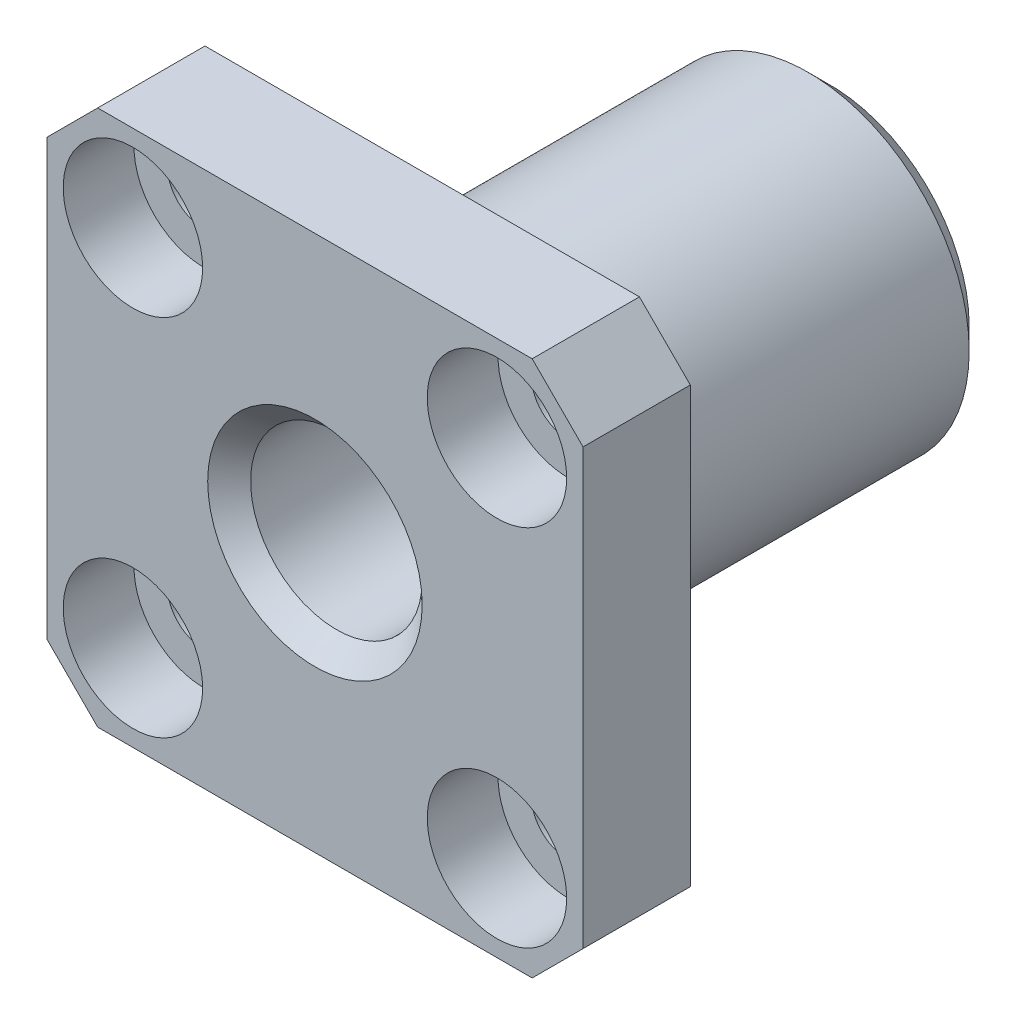
ISO-10303-21;
HEADER;
FILE_DESCRIPTION(('STEP AP214'),'2;1');
FILE_NAME('part.step','',(''),(''),'','','');
FILE_SCHEMA(('AUTOMOTIVE_DESIGN { 1 0 10303 214 1 1 1 1 }'));
ENDSEC;
DATA;
#1=APPLICATION_CONTEXT('core data for automotive mechanical design processes');
#2=APPLICATION_PROTOCOL_DEFINITION('international standard','automotive_design',2000,#1);
#3=PRODUCT_CONTEXT('',#1,'mechanical');
#4=PRODUCT('Part','Part','',(#3));
#5=PRODUCT_RELATED_PRODUCT_CATEGORY('part','',(#4));
#6=PRODUCT_DEFINITION_FORMATION('','',#4);
#7=PRODUCT_DEFINITION_CONTEXT('part definition',#1,'design');
#8=PRODUCT_DEFINITION('design','',#6,#7);
#9=PRODUCT_DEFINITION_SHAPE('','',#8);
#10=(LENGTH_UNIT() NAMED_UNIT(*) SI_UNIT(.MILLI.,.METRE.));
#11=(NAMED_UNIT(*) PLANE_ANGLE_UNIT() SI_UNIT($,.RADIAN.));
#12=(NAMED_UNIT(*) SI_UNIT($,.STERADIAN.) SOLID_ANGLE_UNIT());
#13=UNCERTAINTY_MEASURE_WITH_UNIT(LENGTH_MEASURE(1.E-05),#10,'distance_accuracy_value','');
#14=(GEOMETRIC_REPRESENTATION_CONTEXT(3) GLOBAL_UNCERTAINTY_ASSIGNED_CONTEXT((#13)) GLOBAL_UNIT_ASSIGNED_CONTEXT((#10,
#11,#12)) REPRESENTATION_CONTEXT('',''));
#15=CARTESIAN_POINT('',(0.,0.,0.));
#16=DIRECTION('',(0.,0.,1.));
#17=DIRECTION('',(1.,0.,0.));
#18=AXIS2_PLACEMENT_3D('',#15,#16,#17);
#19=CARTESIAN_POINT('',(0.,0.,24.));
#20=DIRECTION('',(0.,0.,-1.));
#21=DIRECTION('',(-1.,0.,0.));
#22=AXIS2_PLACEMENT_3D('',#19,#20,#21);
#23=CYLINDRICAL_SURFACE('',#22,7.5);
#24=CARTESIAN_POINT('',(0.,0.,1.));
#25=DIRECTION('',(0.,0.,1.));
#26=DIRECTION('',(1.,0.,0.));
#27=AXIS2_PLACEMENT_3D('',#24,#25,#26);
#28=CIRCLE('',#27,7.5);
#29=CARTESIAN_POINT('',(7.5,0.,1.));
#30=VERTEX_POINT('',#29);
#31=EDGE_CURVE('E140',#30,#30,#28,.T.);
#32=ORIENTED_EDGE('',*,*,#31,.T.);
#33=EDGE_LOOP('',(#32));
#34=FACE_BOUND('',#33,.T.);
#35=CARTESIAN_POINT('',(0.,0.,19.));
#36=DIRECTION('',(0.,0.,-1.));
#37=DIRECTION('',(-1.,0.,0.));
#38=AXIS2_PLACEMENT_3D('',#35,#36,#37);
#39=CIRCLE('',#38,7.5);
#40=CARTESIAN_POINT('',(-7.5,0.,19.));
#41=VERTEX_POINT('',#40);
#42=EDGE_CURVE('E137',#41,#41,#39,.T.);
#43=ORIENTED_EDGE('',*,*,#42,.T.);
#44=EDGE_LOOP('',(#43));
#45=FACE_BOUND('',#44,.T.);
#46=ADVANCED_FACE('F32',(#34,#45),#23,.T.);
#47=CARTESIAN_POINT('',(0.,0.,0.));
#48=DIRECTION('',(0.,0.,1.));
#49=DIRECTION('',(1.,0.,0.));
#50=AXIS2_PLACEMENT_3D('',#47,#48,#49);
#51=PLANE('',#50);
#52=CARTESIAN_POINT('',(0.,0.,0.));
#53=DIRECTION('',(0.,0.,1.));
#54=DIRECTION('',(1.,0.,0.));
#55=AXIS2_PLACEMENT_3D('',#52,#53,#54);
#56=CIRCLE('',#55,6.49999999999999);
#57=CARTESIAN_POINT('',(6.49999999999999,0.,0.));
#58=VERTEX_POINT('',#57);
#59=EDGE_CURVE('E163',#58,#58,#56,.F.);
#60=ORIENTED_EDGE('',*,*,#59,.T.);
#61=EDGE_LOOP('',(#60));
#62=FACE_BOUND('',#61,.T.);
#63=CARTESIAN_POINT('',(0.,0.,0.));
#64=DIRECTION('',(0.,0.,1.));
#65=DIRECTION('',(1.,0.,0.));
#66=AXIS2_PLACEMENT_3D('',#63,#64,#65);
#67=CIRCLE('',#66,4.);
#68=CARTESIAN_POINT('',(4.,0.,0.));
#69=VERTEX_POINT('',#68);
#70=EDGE_CURVE('E441',#69,#69,#67,.T.);
#71=ORIENTED_EDGE('',*,*,#70,.T.);
#72=EDGE_LOOP('',(#71));
#73=FACE_BOUND('',#72,.T.);
#74=ADVANCED_FACE('F180',(#62,#73),#51,.F.);
#75=CARTESIAN_POINT('',(12.5,-12.5,19.));
#76=DIRECTION('',(1.,0.,0.));
#77=DIRECTION('',(0.,0.,-1.));
#78=AXIS2_PLACEMENT_3D('',#75,#76,#77);
#79=PLANE('',#78);
#80=DIRECTION('',(0.,0.,1.));
#81=VECTOR('',#80,1.);
#82=CARTESIAN_POINT('',(12.5,-10.1274169979695,0.));
#83=LINE('',#82,#81);
#84=CARTESIAN_POINT('',(12.5,-10.1274169979695,19.));
#85=VERTEX_POINT('',#84);
#86=CARTESIAN_POINT('',(12.5,-10.1274169979695,24.));
#87=VERTEX_POINT('',#86);
#88=EDGE_CURVE('E473',#85,#87,#83,.T.);
#89=ORIENTED_EDGE('',*,*,#88,.F.);
#90=DIRECTION('',(0.,1.,0.));
#91=VECTOR('',#90,1.);
#92=CARTESIAN_POINT('',(12.5,-12.5,19.));
#93=LINE('',#92,#91);
#94=CARTESIAN_POINT('',(12.5,10.1274169979695,19.));
#95=VERTEX_POINT('',#94);
#96=EDGE_CURVE('E116',#85,#95,#93,.T.);
#97=ORIENTED_EDGE('',*,*,#96,.T.);
#98=DIRECTION('',(0.,0.,1.));
#99=VECTOR('',#98,1.);
#100=CARTESIAN_POINT('',(12.5,10.1274169979695,0.));
#101=LINE('',#100,#99);
#102=CARTESIAN_POINT('',(12.5,10.1274169979695,24.));
#103=VERTEX_POINT('',#102);
#104=EDGE_CURVE('E99',#95,#103,#101,.T.);
#105=ORIENTED_EDGE('',*,*,#104,.T.);
#106=DIRECTION('',(0.,1.,0.));
#107=VECTOR('',#106,1.);
#108=CARTESIAN_POINT('',(12.5,-12.5,24.));
#109=LINE('',#108,#107);
#110=EDGE_CURVE('E114',#87,#103,#109,.T.);
#111=ORIENTED_EDGE('',*,*,#110,.F.);
#112=EDGE_LOOP('',(#89,#97,#105,#111));
#113=FACE_BOUND('',#112,.T.);
#114=ADVANCED_FACE('F113',(#113),#79,.T.);
#115=CARTESIAN_POINT('',(-12.5,-12.5,19.));
#116=DIRECTION('',(0.,-1.,0.));
#117=DIRECTION('',(0.,0.,-1.));
#118=AXIS2_PLACEMENT_3D('',#115,#116,#117);
#119=PLANE('',#118);
#120=DIRECTION('',(0.,0.,1.));
#121=VECTOR('',#120,1.);
#122=CARTESIAN_POINT('',(-10.1274169979695,-12.5,0.));
#123=LINE('',#122,#121);
#124=CARTESIAN_POINT('',(-10.1274169979695,-12.5,19.));
#125=VERTEX_POINT('',#124);
#126=CARTESIAN_POINT('',(-10.1274169979695,-12.5,24.));
#127=VERTEX_POINT('',#126);
#128=EDGE_CURVE('E47',#125,#127,#123,.T.);
#129=ORIENTED_EDGE('',*,*,#128,.F.);
#130=DIRECTION('',(1.,0.,0.));
#131=VECTOR('',#130,1.);
#132=CARTESIAN_POINT('',(-12.5,-12.5,19.));
#133=LINE('',#132,#131);
#134=CARTESIAN_POINT('',(10.1274169979695,-12.5,19.));
#135=VERTEX_POINT('',#134);
#136=EDGE_CURVE('E130',#125,#135,#133,.T.);
#137=ORIENTED_EDGE('',*,*,#136,.T.);
#138=DIRECTION('',(0.,0.,1.));
#139=VECTOR('',#138,1.);
#140=CARTESIAN_POINT('',(10.1274169979695,-12.5,0.));
#141=LINE('',#140,#139);
#142=CARTESIAN_POINT('',(10.1274169979695,-12.5,24.));
#143=VERTEX_POINT('',#142);
#144=EDGE_CURVE('E107',#135,#143,#141,.T.);
#145=ORIENTED_EDGE('',*,*,#144,.T.);
#146=DIRECTION('',(1.,0.,0.));
#147=VECTOR('',#146,1.);
#148=CARTESIAN_POINT('',(-12.5,-12.5,24.));
#149=LINE('',#148,#147);
#150=EDGE_CURVE('E135',#127,#143,#149,.T.);
#151=ORIENTED_EDGE('',*,*,#150,.F.);
#152=EDGE_LOOP('',(#129,#137,#145,#151));
#153=FACE_BOUND('',#152,.T.);
#154=ADVANCED_FACE('F197',(#153),#119,.T.);
#155=CARTESIAN_POINT('',(-12.5,-12.5,19.));
#156=DIRECTION('',(-1.,0.,0.));
#157=DIRECTION('',(0.,0.,1.));
#158=AXIS2_PLACEMENT_3D('',#155,#156,#157);
#159=PLANE('',#158);
#160=DIRECTION('',(0.,0.,1.));
#161=VECTOR('',#160,1.);
#162=CARTESIAN_POINT('',(-12.5,-10.1274169979695,0.));
#163=LINE('',#162,#161);
#164=CARTESIAN_POINT('',(-12.5,-10.1274169979695,19.));
#165=VERTEX_POINT('',#164);
#166=CARTESIAN_POINT('',(-12.5,-10.1274169979695,24.));
#167=VERTEX_POINT('',#166);
#168=EDGE_CURVE('E478',#165,#167,#163,.T.);
#169=ORIENTED_EDGE('',*,*,#168,.T.);
#170=DIRECTION('',(0.,-1.,0.));
#171=VECTOR('',#170,1.);
#172=CARTESIAN_POINT('',(-12.5,-12.5,24.));
#173=LINE('',#172,#171);
#174=CARTESIAN_POINT('',(-12.5,10.1274169979695,24.));
#175=VERTEX_POINT('',#174);
#176=EDGE_CURVE('E125',#175,#167,#173,.T.);
#177=ORIENTED_EDGE('',*,*,#176,.F.);
#178=DIRECTION('',(0.,0.,1.));
#179=VECTOR('',#178,1.);
#180=CARTESIAN_POINT('',(-12.5,10.1274169979695,0.));
#181=LINE('',#180,#179);
#182=CARTESIAN_POINT('',(-12.5,10.1274169979695,19.));
#183=VERTEX_POINT('',#182);
#184=EDGE_CURVE('E55',#183,#175,#181,.T.);
#185=ORIENTED_EDGE('',*,*,#184,.F.);
#186=DIRECTION('',(0.,-1.,0.));
#187=VECTOR('',#186,1.);
#188=CARTESIAN_POINT('',(-12.5,-12.5,19.));
#189=LINE('',#188,#187);
#190=EDGE_CURVE('E495',#183,#165,#189,.T.);
#191=ORIENTED_EDGE('',*,*,#190,.T.);
#192=EDGE_LOOP('',(#169,#177,#185,#191));
#193=FACE_BOUND('',#192,.T.);
#194=ADVANCED_FACE('F201',(#193),#159,.T.);
#195=CARTESIAN_POINT('',(-12.5,12.5,19.));
#196=DIRECTION('',(0.,1.,0.));
#197=DIRECTION('',(0.,0.,1.));
#198=AXIS2_PLACEMENT_3D('',#195,#196,#197);
#199=PLANE('',#198);
#200=DIRECTION('',(0.,0.,1.));
#201=VECTOR('',#200,1.);
#202=CARTESIAN_POINT('',(10.1274169979695,12.5,0.));
#203=LINE('',#202,#201);
#204=CARTESIAN_POINT('',(10.1274169979695,12.5,19.));
#205=VERTEX_POINT('',#204);
#206=CARTESIAN_POINT('',(10.1274169979695,12.5,24.));
#207=VERTEX_POINT('',#206);
#208=EDGE_CURVE('E102',#205,#207,#203,.T.);
#209=ORIENTED_EDGE('',*,*,#208,.F.);
#210=DIRECTION('',(-1.,0.,0.));
#211=VECTOR('',#210,1.);
#212=CARTESIAN_POINT('',(-12.5,12.5,19.));
#213=LINE('',#212,#211);
#214=CARTESIAN_POINT('',(-10.1274169979695,12.5,19.));
#215=VERTEX_POINT('',#214);
#216=EDGE_CURVE('E493',#205,#215,#213,.T.);
#217=ORIENTED_EDGE('',*,*,#216,.T.);
#218=DIRECTION('',(0.,0.,1.));
#219=VECTOR('',#218,1.);
#220=CARTESIAN_POINT('',(-10.1274169979695,12.5,0.));
#221=LINE('',#220,#219);
#222=CARTESIAN_POINT('',(-10.1274169979695,12.5,24.));
#223=VERTEX_POINT('',#222);
#224=EDGE_CURVE('E483',#215,#223,#221,.T.);
#225=ORIENTED_EDGE('',*,*,#224,.T.);
#226=DIRECTION('',(-1.,0.,0.));
#227=VECTOR('',#226,1.);
#228=CARTESIAN_POINT('',(-12.5,12.5,24.));
#229=LINE('',#228,#227);
#230=EDGE_CURVE('E122',#207,#223,#229,.T.);
#231=ORIENTED_EDGE('',*,*,#230,.F.);
#232=EDGE_LOOP('',(#209,#217,#225,#231));
#233=FACE_BOUND('',#232,.T.);
#234=ADVANCED_FACE('F198',(#233),#199,.T.);
#235=CARTESIAN_POINT('',(0.,0.,19.));
#236=DIRECTION('',(0.,0.,-1.));
#237=DIRECTION('',(-1.,0.,0.));
#238=AXIS2_PLACEMENT_3D('',#235,#236,#237);
#239=PLANE('',#238);
#240=CARTESIAN_POINT('',(-8.48528137423857,8.48528137423857,19.));
#241=DIRECTION('',(0.,0.,-1.));
#242=DIRECTION('',(-1.,0.,0.));
#243=AXIS2_PLACEMENT_3D('',#240,#241,#242);
#244=CIRCLE('',#243,1.7);
#245=CARTESIAN_POINT('',(-10.1852813742386,8.48528137423857,19.));
#246=VERTEX_POINT('',#245);
#247=EDGE_CURVE('E156',#246,#246,#244,.T.);
#248=ORIENTED_EDGE('',*,*,#247,.F.);
#249=EDGE_LOOP('',(#248));
#250=FACE_BOUND('',#249,.T.);
#251=CARTESIAN_POINT('',(8.48528137423857,8.48528137423857,19.));
#252=DIRECTION('',(0.,0.,-1.));
#253=DIRECTION('',(-1.,0.,0.));
#254=AXIS2_PLACEMENT_3D('',#251,#252,#253);
#255=CIRCLE('',#254,1.7);
#256=CARTESIAN_POINT('',(6.78528137423857,8.48528137423857,19.));
#257=VERTEX_POINT('',#256);
#258=EDGE_CURVE('E151',#257,#257,#255,.T.);
#259=ORIENTED_EDGE('',*,*,#258,.F.);
#260=EDGE_LOOP('',(#259));
#261=FACE_BOUND('',#260,.T.);
#262=CARTESIAN_POINT('',(8.48528137423857,-8.48528137423857,19.));
#263=DIRECTION('',(0.,0.,-1.));
#264=DIRECTION('',(-1.,0.,0.));
#265=AXIS2_PLACEMENT_3D('',#262,#263,#264);
#266=CIRCLE('',#265,1.7);
#267=CARTESIAN_POINT('',(6.78528137423858,-8.48528137423857,19.));
#268=VERTEX_POINT('',#267);
#269=EDGE_CURVE('E146',#268,#268,#266,.T.);
#270=ORIENTED_EDGE('',*,*,#269,.F.);
#271=EDGE_LOOP('',(#270));
#272=FACE_BOUND('',#271,.T.);
#273=CARTESIAN_POINT('',(-8.48528137423857,-8.48528137423857,19.));
#274=DIRECTION('',(0.,0.,-1.));
#275=DIRECTION('',(-1.,0.,0.));
#276=AXIS2_PLACEMENT_3D('',#273,#274,#275);
#277=CIRCLE('',#276,1.7);
#278=CARTESIAN_POINT('',(-10.1852813742386,-8.48528137423857,19.));
#279=VERTEX_POINT('',#278);
#280=EDGE_CURVE('E141',#279,#279,#277,.T.);
#281=ORIENTED_EDGE('',*,*,#280,.F.);
#282=EDGE_LOOP('',(#281));
#283=FACE_BOUND('',#282,.T.);
#284=DIRECTION('',(0.707106781186548,-0.707106781186548,0.));
#285=VECTOR('',#284,1.);
#286=CARTESIAN_POINT('',(-11.3137084989848,-11.3137084989848,19.));
#287=LINE('',#286,#285);
#288=EDGE_CURVE('E123',#165,#125,#287,.T.);
#289=ORIENTED_EDGE('',*,*,#288,.F.);
#290=ORIENTED_EDGE('',*,*,#190,.F.);
#291=DIRECTION('',(-0.707106781186548,-0.707106781186548,0.));
#292=VECTOR('',#291,1.);
#293=CARTESIAN_POINT('',(-11.3137084989848,11.3137084989848,19.));
#294=LINE('',#293,#292);
#295=EDGE_CURVE('E486',#215,#183,#294,.T.);
#296=ORIENTED_EDGE('',*,*,#295,.F.);
#297=ORIENTED_EDGE('',*,*,#216,.F.);
#298=DIRECTION('',(-0.707106781186548,0.707106781186548,0.));
#299=VECTOR('',#298,1.);
#300=CARTESIAN_POINT('',(11.3137084989848,11.3137084989848,19.));
#301=LINE('',#300,#299);
#302=EDGE_CURVE('E489',#95,#205,#301,.T.);
#303=ORIENTED_EDGE('',*,*,#302,.F.);
#304=ORIENTED_EDGE('',*,*,#96,.F.);
#305=DIRECTION('',(0.707106781186548,0.707106781186548,0.));
#306=VECTOR('',#305,1.);
#307=CARTESIAN_POINT('',(11.3137084989848,-11.3137084989848,19.));
#308=LINE('',#307,#306);
#309=EDGE_CURVE('E127',#135,#85,#308,.T.);
#310=ORIENTED_EDGE('',*,*,#309,.F.);
#311=ORIENTED_EDGE('',*,*,#136,.F.);
#312=EDGE_LOOP('',(#289,#290,#296,#297,#303,#304,#310,#311));
#313=FACE_BOUND('',#312,.T.);
#314=ORIENTED_EDGE('',*,*,#42,.F.);
#315=EDGE_LOOP('',(#314));
#316=FACE_BOUND('',#315,.T.);
#317=ADVANCED_FACE('F193',(#250,#261,#272,#283,#313,#316),#239,.T.);
#318=CARTESIAN_POINT('',(0.,0.,24.));
#319=DIRECTION('',(0.,0.,1.));
#320=DIRECTION('',(1.,0.,0.));
#321=AXIS2_PLACEMENT_3D('',#318,#319,#320);
#322=PLANE('',#321);
#323=CARTESIAN_POINT('',(0.,0.,24.));
#324=DIRECTION('',(0.,0.,1.));
#325=DIRECTION('',(1.,0.,0.));
#326=AXIS2_PLACEMENT_3D('',#323,#324,#325);
#327=CIRCLE('',#326,5.);
#328=CARTESIAN_POINT('',(5.,0.,24.));
#329=VERTEX_POINT('',#328);
#330=EDGE_CURVE('E11',#329,#329,#327,.F.);
#331=ORIENTED_EDGE('',*,*,#330,.T.);
#332=EDGE_LOOP('',(#331));
#333=FACE_BOUND('',#332,.T.);
#334=CARTESIAN_POINT('',(-8.48528137423857,8.48528137423857,24.));
#335=DIRECTION('',(0.,0.,1.));
#336=DIRECTION('',(1.,0.,0.));
#337=AXIS2_PLACEMENT_3D('',#334,#335,#336);
#338=CIRCLE('',#337,3.25);
#339=CARTESIAN_POINT('',(-5.23528137423857,8.48528137423857,24.));
#340=VERTEX_POINT('',#339);
#341=EDGE_CURVE('E439',#340,#340,#338,.T.);
#342=ORIENTED_EDGE('',*,*,#341,.F.);
#343=EDGE_LOOP('',(#342));
#344=FACE_BOUND('',#343,.T.);
#345=CARTESIAN_POINT('',(8.48528137423857,8.48528137423857,24.));
#346=DIRECTION('',(0.,0.,1.));
#347=DIRECTION('',(1.,0.,0.));
#348=AXIS2_PLACEMENT_3D('',#345,#346,#347);
#349=CIRCLE('',#348,3.25);
#350=CARTESIAN_POINT('',(11.7352813742386,8.48528137423857,24.));
#351=VERTEX_POINT('',#350);
#352=EDGE_CURVE('E159',#351,#351,#349,.T.);
#353=ORIENTED_EDGE('',*,*,#352,.F.);
#354=EDGE_LOOP('',(#353));
#355=FACE_BOUND('',#354,.T.);
#356=CARTESIAN_POINT('',(8.48528137423857,-8.48528137423857,24.));
#357=DIRECTION('',(0.,0.,1.));
#358=DIRECTION('',(1.,0.,0.));
#359=AXIS2_PLACEMENT_3D('',#356,#357,#358);
#360=CIRCLE('',#359,3.25);
#361=CARTESIAN_POINT('',(11.7352813742386,-8.48528137423857,24.));
#362=VERTEX_POINT('',#361);
#363=EDGE_CURVE('E154',#362,#362,#360,.T.);
#364=ORIENTED_EDGE('',*,*,#363,.F.);
#365=EDGE_LOOP('',(#364));
#366=FACE_BOUND('',#365,.T.);
#367=CARTESIAN_POINT('',(-8.48528137423857,-8.48528137423857,24.));
#368=DIRECTION('',(0.,0.,1.));
#369=DIRECTION('',(1.,0.,0.));
#370=AXIS2_PLACEMENT_3D('',#367,#368,#369);
#371=CIRCLE('',#370,3.25);
#372=CARTESIAN_POINT('',(-5.23528137423857,-8.48528137423857,24.));
#373=VERTEX_POINT('',#372);
#374=EDGE_CURVE('E149',#373,#373,#371,.T.);
#375=ORIENTED_EDGE('',*,*,#374,.F.);
#376=EDGE_LOOP('',(#375));
#377=FACE_BOUND('',#376,.T.);
#378=DIRECTION('',(-0.707106781186547,0.707106781186547,0.));
#379=VECTOR('',#378,1.);
#380=CARTESIAN_POINT('',(-12.5,-10.1274169979695,24.));
#381=LINE('',#380,#379);
#382=EDGE_CURVE('E144',#127,#167,#381,.T.);
#383=ORIENTED_EDGE('',*,*,#382,.F.);
#384=ORIENTED_EDGE('',*,*,#150,.T.);
#385=DIRECTION('',(-0.707106781186547,-0.707106781186547,0.));
#386=VECTOR('',#385,1.);
#387=CARTESIAN_POINT('',(12.5,-10.1274169979695,24.));
#388=LINE('',#387,#386);
#389=EDGE_CURVE('E121',#87,#143,#388,.T.);
#390=ORIENTED_EDGE('',*,*,#389,.F.);
#391=ORIENTED_EDGE('',*,*,#110,.T.);
#392=DIRECTION('',(0.707106781186547,-0.707106781186547,0.));
#393=VECTOR('',#392,1.);
#394=CARTESIAN_POINT('',(12.5,10.1274169979695,24.));
#395=LINE('',#394,#393);
#396=EDGE_CURVE('E96',#207,#103,#395,.T.);
#397=ORIENTED_EDGE('',*,*,#396,.F.);
#398=ORIENTED_EDGE('',*,*,#230,.T.);
#399=DIRECTION('',(0.707106781186547,0.707106781186547,0.));
#400=VECTOR('',#399,1.);
#401=CARTESIAN_POINT('',(-12.5,10.1274169979695,24.));
#402=LINE('',#401,#400);
#403=EDGE_CURVE('E470',#175,#223,#402,.T.);
#404=ORIENTED_EDGE('',*,*,#403,.F.);
#405=ORIENTED_EDGE('',*,*,#176,.T.);
#406=EDGE_LOOP('',(#383,#384,#390,#391,#397,#398,#404,#405));
#407=FACE_BOUND('',#406,.T.);
#408=ADVANCED_FACE('F119',(#333,#344,#355,#366,#377,#407),#322,.T.);
#409=CARTESIAN_POINT('',(-12.5,10.1274169979695,0.));
#410=DIRECTION('',(0.707106781186548,-0.707106781186548,0.));
#411=DIRECTION('',(0.707106781186548,0.707106781186548,0.));
#412=AXIS2_PLACEMENT_3D('',#409,#410,#411);
#413=PLANE('',#412);
#414=ORIENTED_EDGE('',*,*,#295,.T.);
#415=ORIENTED_EDGE('',*,*,#184,.T.);
#416=ORIENTED_EDGE('',*,*,#403,.T.);
#417=ORIENTED_EDGE('',*,*,#224,.F.);
#418=EDGE_LOOP('',(#414,#415,#416,#417));
#419=FACE_BOUND('',#418,.T.);
#420=ADVANCED_FACE('F192',(#419),#413,.F.);
#421=CARTESIAN_POINT('',(12.5,10.1274169979695,0.));
#422=DIRECTION('',(-0.707106781186548,-0.707106781186548,0.));
#423=DIRECTION('',(0.707106781186548,-0.707106781186548,0.));
#424=AXIS2_PLACEMENT_3D('',#421,#422,#423);
#425=PLANE('',#424);
#426=ORIENTED_EDGE('',*,*,#302,.T.);
#427=ORIENTED_EDGE('',*,*,#208,.T.);
#428=ORIENTED_EDGE('',*,*,#396,.T.);
#429=ORIENTED_EDGE('',*,*,#104,.F.);
#430=EDGE_LOOP('',(#426,#427,#428,#429));
#431=FACE_BOUND('',#430,.T.);
#432=ADVANCED_FACE('F98',(#431),#425,.F.);
#433=CARTESIAN_POINT('',(12.5,-10.1274169979695,0.));
#434=DIRECTION('',(-0.707106781186548,0.707106781186548,0.));
#435=DIRECTION('',(-0.707106781186548,-0.707106781186548,0.));
#436=AXIS2_PLACEMENT_3D('',#433,#434,#435);
#437=PLANE('',#436);
#438=ORIENTED_EDGE('',*,*,#309,.T.);
#439=ORIENTED_EDGE('',*,*,#88,.T.);
#440=ORIENTED_EDGE('',*,*,#389,.T.);
#441=ORIENTED_EDGE('',*,*,#144,.F.);
#442=EDGE_LOOP('',(#438,#439,#440,#441));
#443=FACE_BOUND('',#442,.T.);
#444=ADVANCED_FACE('F218',(#443),#437,.F.);
#445=CARTESIAN_POINT('',(-12.5,-10.1274169979695,0.));
#446=DIRECTION('',(0.707106781186548,0.707106781186548,0.));
#447=DIRECTION('',(-0.707106781186548,0.707106781186548,0.));
#448=AXIS2_PLACEMENT_3D('',#445,#446,#447);
#449=PLANE('',#448);
#450=ORIENTED_EDGE('',*,*,#288,.T.);
#451=ORIENTED_EDGE('',*,*,#128,.T.);
#452=ORIENTED_EDGE('',*,*,#382,.T.);
#453=ORIENTED_EDGE('',*,*,#168,.F.);
#454=EDGE_LOOP('',(#450,#451,#452,#453));
#455=FACE_BOUND('',#454,.T.);
#456=ADVANCED_FACE('F214',(#455),#449,.F.);
#457=CARTESIAN_POINT('',(-8.48528137423857,-8.48528137423857,24.));
#458=DIRECTION('',(0.,0.,1.));
#459=DIRECTION('',(1.,0.,0.));
#460=AXIS2_PLACEMENT_3D('',#457,#458,#459);
#461=CYLINDRICAL_SURFACE('',#460,1.7);
#462=ORIENTED_EDGE('',*,*,#280,.T.);
#463=EDGE_LOOP('',(#462));
#464=FACE_BOUND('',#463,.T.);
#465=CARTESIAN_POINT('',(-8.48528137423857,-8.48528137423857,20.7));
#466=DIRECTION('',(0.,0.,1.));
#467=DIRECTION('',(1.,0.,0.));
#468=AXIS2_PLACEMENT_3D('',#465,#466,#467);
#469=CIRCLE('',#468,1.7);
#470=CARTESIAN_POINT('',(-6.78528137423857,-8.48528137423857,20.7));
#471=VERTEX_POINT('',#470);
#472=EDGE_CURVE('E145',#471,#471,#469,.T.);
#473=ORIENTED_EDGE('',*,*,#472,.T.);
#474=EDGE_LOOP('',(#473));
#475=FACE_BOUND('',#474,.T.);
#476=ADVANCED_FACE('F217',(#464,#475),#461,.F.);
#477=CARTESIAN_POINT('',(-6.78528137423857,-8.48528137423857,20.7));
#478=DIRECTION('',(0.,0.,-1.));
#479=DIRECTION('',(-1.,0.,0.));
#480=AXIS2_PLACEMENT_3D('',#477,#478,#479);
#481=PLANE('',#480);
#482=ORIENTED_EDGE('',*,*,#472,.F.);
#483=EDGE_LOOP('',(#482));
#484=FACE_BOUND('',#483,.T.);
#485=CARTESIAN_POINT('',(-8.48528137423857,-8.48528137423857,20.7));
#486=DIRECTION('',(0.,0.,1.));
#487=DIRECTION('',(1.,0.,0.));
#488=AXIS2_PLACEMENT_3D('',#485,#486,#487);
#489=CIRCLE('',#488,3.25);
#490=CARTESIAN_POINT('',(-5.23528137423857,-8.48528137423857,20.7));
#491=VERTEX_POINT('',#490);
#492=EDGE_CURVE('E465',#491,#491,#489,.T.);
#493=ORIENTED_EDGE('',*,*,#492,.T.);
#494=EDGE_LOOP('',(#493));
#495=FACE_BOUND('',#494,.T.);
#496=ADVANCED_FACE('F226',(#484,#495),#481,.F.);
#497=CARTESIAN_POINT('',(-8.48528137423857,-8.48528137423857,24.));
#498=DIRECTION('',(0.,0.,1.));
#499=DIRECTION('',(1.,0.,0.));
#500=AXIS2_PLACEMENT_3D('',#497,#498,#499);
#501=CYLINDRICAL_SURFACE('',#500,3.25);
#502=ORIENTED_EDGE('',*,*,#492,.F.);
#503=EDGE_LOOP('',(#502));
#504=FACE_BOUND('',#503,.T.);
#505=ORIENTED_EDGE('',*,*,#374,.T.);
#506=EDGE_LOOP('',(#505));
#507=FACE_BOUND('',#506,.T.);
#508=ADVANCED_FACE('F230',(#504,#507),#501,.F.);
#509=CARTESIAN_POINT('',(8.48528137423857,-8.48528137423857,24.));
#510=DIRECTION('',(0.,0.,1.));
#511=DIRECTION('',(1.,0.,0.));
#512=AXIS2_PLACEMENT_3D('',#509,#510,#511);
#513=CYLINDRICAL_SURFACE('',#512,1.7);
#514=ORIENTED_EDGE('',*,*,#269,.T.);
#515=EDGE_LOOP('',(#514));
#516=FACE_BOUND('',#515,.T.);
#517=CARTESIAN_POINT('',(8.48528137423857,-8.48528137423857,20.7));
#518=DIRECTION('',(0.,0.,1.));
#519=DIRECTION('',(1.,0.,0.));
#520=AXIS2_PLACEMENT_3D('',#517,#518,#519);
#521=CIRCLE('',#520,1.7);
#522=CARTESIAN_POINT('',(10.1852813742386,-8.48528137423857,20.7));
#523=VERTEX_POINT('',#522);
#524=EDGE_CURVE('E150',#523,#523,#521,.T.);
#525=ORIENTED_EDGE('',*,*,#524,.T.);
#526=EDGE_LOOP('',(#525));
#527=FACE_BOUND('',#526,.T.);
#528=ADVANCED_FACE('F234',(#516,#527),#513,.F.);
#529=CARTESIAN_POINT('',(10.1852813742386,-8.48528137423857,20.7));
#530=DIRECTION('',(0.,0.,-1.));
#531=DIRECTION('',(-1.,0.,0.));
#532=AXIS2_PLACEMENT_3D('',#529,#530,#531);
#533=PLANE('',#532);
#534=ORIENTED_EDGE('',*,*,#524,.F.);
#535=EDGE_LOOP('',(#534));
#536=FACE_BOUND('',#535,.T.);
#537=CARTESIAN_POINT('',(8.48528137423857,-8.48528137423857,20.7));
#538=DIRECTION('',(0.,0.,1.));
#539=DIRECTION('',(1.,0.,0.));
#540=AXIS2_PLACEMENT_3D('',#537,#538,#539);
#541=CIRCLE('',#540,3.25);
#542=CARTESIAN_POINT('',(11.7352813742386,-8.48528137423857,20.7));
#543=VERTEX_POINT('',#542);
#544=EDGE_CURVE('E458',#543,#543,#541,.T.);
#545=ORIENTED_EDGE('',*,*,#544,.T.);
#546=EDGE_LOOP('',(#545));
#547=FACE_BOUND('',#546,.T.);
#548=ADVANCED_FACE('F238',(#536,#547),#533,.F.);
#549=CARTESIAN_POINT('',(8.48528137423857,-8.48528137423857,24.));
#550=DIRECTION('',(0.,0.,1.));
#551=DIRECTION('',(1.,0.,0.));
#552=AXIS2_PLACEMENT_3D('',#549,#550,#551);
#553=CYLINDRICAL_SURFACE('',#552,3.25);
#554=ORIENTED_EDGE('',*,*,#544,.F.);
#555=EDGE_LOOP('',(#554));
#556=FACE_BOUND('',#555,.T.);
#557=ORIENTED_EDGE('',*,*,#363,.T.);
#558=EDGE_LOOP('',(#557));
#559=FACE_BOUND('',#558,.T.);
#560=ADVANCED_FACE('F242',(#556,#559),#553,.F.);
#561=CARTESIAN_POINT('',(8.48528137423857,8.48528137423857,24.));
#562=DIRECTION('',(0.,0.,1.));
#563=DIRECTION('',(1.,0.,0.));
#564=AXIS2_PLACEMENT_3D('',#561,#562,#563);
#565=CYLINDRICAL_SURFACE('',#564,1.7);
#566=ORIENTED_EDGE('',*,*,#258,.T.);
#567=EDGE_LOOP('',(#566));
#568=FACE_BOUND('',#567,.T.);
#569=CARTESIAN_POINT('',(8.48528137423857,8.48528137423857,20.7));
#570=DIRECTION('',(0.,0.,1.));
#571=DIRECTION('',(1.,0.,0.));
#572=AXIS2_PLACEMENT_3D('',#569,#570,#571);
#573=CIRCLE('',#572,1.7);
#574=CARTESIAN_POINT('',(10.1852813742386,8.48528137423857,20.7));
#575=VERTEX_POINT('',#574);
#576=EDGE_CURVE('E155',#575,#575,#573,.T.);
#577=ORIENTED_EDGE('',*,*,#576,.T.);
#578=EDGE_LOOP('',(#577));
#579=FACE_BOUND('',#578,.T.);
#580=ADVANCED_FACE('F246',(#568,#579),#565,.F.);
#581=CARTESIAN_POINT('',(10.1852813742386,8.48528137423857,20.7));
#582=DIRECTION('',(0.,0.,-1.));
#583=DIRECTION('',(-1.,0.,0.));
#584=AXIS2_PLACEMENT_3D('',#581,#582,#583);
#585=PLANE('',#584);
#586=ORIENTED_EDGE('',*,*,#576,.F.);
#587=EDGE_LOOP('',(#586));
#588=FACE_BOUND('',#587,.T.);
#589=CARTESIAN_POINT('',(8.48528137423857,8.48528137423857,20.7));
#590=DIRECTION('',(0.,0.,1.));
#591=DIRECTION('',(1.,0.,0.));
#592=AXIS2_PLACEMENT_3D('',#589,#590,#591);
#593=CIRCLE('',#592,3.25);
#594=CARTESIAN_POINT('',(11.7352813742386,8.48528137423857,20.7));
#595=VERTEX_POINT('',#594);
#596=EDGE_CURVE('E451',#595,#595,#593,.T.);
#597=ORIENTED_EDGE('',*,*,#596,.T.);
#598=EDGE_LOOP('',(#597));
#599=FACE_BOUND('',#598,.T.);
#600=ADVANCED_FACE('F250',(#588,#599),#585,.F.);
#601=CARTESIAN_POINT('',(8.48528137423857,8.48528137423857,24.));
#602=DIRECTION('',(0.,0.,1.));
#603=DIRECTION('',(1.,0.,0.));
#604=AXIS2_PLACEMENT_3D('',#601,#602,#603);
#605=CYLINDRICAL_SURFACE('',#604,3.25);
#606=ORIENTED_EDGE('',*,*,#596,.F.);
#607=EDGE_LOOP('',(#606));
#608=FACE_BOUND('',#607,.T.);
#609=ORIENTED_EDGE('',*,*,#352,.T.);
#610=EDGE_LOOP('',(#609));
#611=FACE_BOUND('',#610,.T.);
#612=ADVANCED_FACE('F254',(#608,#611),#605,.F.);
#613=CARTESIAN_POINT('',(-8.48528137423857,8.48528137423857,24.));
#614=DIRECTION('',(0.,0.,1.));
#615=DIRECTION('',(1.,0.,0.));
#616=AXIS2_PLACEMENT_3D('',#613,#614,#615);
#617=CYLINDRICAL_SURFACE('',#616,1.7);
#618=ORIENTED_EDGE('',*,*,#247,.T.);
#619=EDGE_LOOP('',(#618));
#620=FACE_BOUND('',#619,.T.);
#621=CARTESIAN_POINT('',(-8.48528137423857,8.48528137423857,20.7));
#622=DIRECTION('',(0.,0.,1.));
#623=DIRECTION('',(1.,0.,0.));
#624=AXIS2_PLACEMENT_3D('',#621,#622,#623);
#625=CIRCLE('',#624,1.7);
#626=CARTESIAN_POINT('',(-6.78528137423857,8.48528137423857,20.7));
#627=VERTEX_POINT('',#626);
#628=EDGE_CURVE('E160',#627,#627,#625,.T.);
#629=ORIENTED_EDGE('',*,*,#628,.T.);
#630=EDGE_LOOP('',(#629));
#631=FACE_BOUND('',#630,.T.);
#632=ADVANCED_FACE('F258',(#620,#631),#617,.F.);
#633=CARTESIAN_POINT('',(-6.78528137423857,8.48528137423857,20.7));
#634=DIRECTION('',(0.,0.,-1.));
#635=DIRECTION('',(-1.,0.,0.));
#636=AXIS2_PLACEMENT_3D('',#633,#634,#635);
#637=PLANE('',#636);
#638=ORIENTED_EDGE('',*,*,#628,.F.);
#639=EDGE_LOOP('',(#638));
#640=FACE_BOUND('',#639,.T.);
#641=CARTESIAN_POINT('',(-8.48528137423857,8.48528137423857,20.7));
#642=DIRECTION('',(0.,0.,1.));
#643=DIRECTION('',(1.,0.,0.));
#644=AXIS2_PLACEMENT_3D('',#641,#642,#643);
#645=CIRCLE('',#644,3.25);
#646=CARTESIAN_POINT('',(-5.23528137423857,8.48528137423857,20.7));
#647=VERTEX_POINT('',#646);
#648=EDGE_CURVE('E436',#647,#647,#645,.T.);
#649=ORIENTED_EDGE('',*,*,#648,.T.);
#650=EDGE_LOOP('',(#649));
#651=FACE_BOUND('',#650,.T.);
#652=ADVANCED_FACE('F262',(#640,#651),#637,.F.);
#653=CARTESIAN_POINT('',(-8.48528137423857,8.48528137423857,24.));
#654=DIRECTION('',(0.,0.,1.));
#655=DIRECTION('',(1.,0.,0.));
#656=AXIS2_PLACEMENT_3D('',#653,#654,#655);
#657=CYLINDRICAL_SURFACE('',#656,3.25);
#658=ORIENTED_EDGE('',*,*,#648,.F.);
#659=EDGE_LOOP('',(#658));
#660=FACE_BOUND('',#659,.T.);
#661=ORIENTED_EDGE('',*,*,#341,.T.);
#662=EDGE_LOOP('',(#661));
#663=FACE_BOUND('',#662,.T.);
#664=ADVANCED_FACE('F266',(#660,#663),#657,.F.);
#665=CARTESIAN_POINT('',(0.,0.,0.));
#666=DIRECTION('',(0.,0.,1.));
#667=DIRECTION('',(1.,0.,0.));
#668=AXIS2_PLACEMENT_3D('',#665,#666,#667);
#669=CYLINDRICAL_SURFACE('',#668,4.);
#670=CARTESIAN_POINT('',(0.,0.,23.));
#671=DIRECTION('',(0.,0.,1.));
#672=DIRECTION('',(1.,0.,0.));
#673=AXIS2_PLACEMENT_3D('',#670,#671,#672);
#674=CIRCLE('',#673,4.);
#675=CARTESIAN_POINT('',(4.,0.,23.));
#676=VERTEX_POINT('',#675);
#677=EDGE_CURVE('E40',#676,#676,#674,.T.);
#678=ORIENTED_EDGE('',*,*,#677,.T.);
#679=EDGE_LOOP('',(#678));
#680=FACE_BOUND('',#679,.T.);
#681=ORIENTED_EDGE('',*,*,#70,.F.);
#682=EDGE_LOOP('',(#681));
#683=FACE_BOUND('',#682,.T.);
#684=ADVANCED_FACE('F168',(#680,#683),#669,.F.);
#685=CARTESIAN_POINT('',(0.,0.,1.));
#686=DIRECTION('',(0.,0.,1.));
#687=DIRECTION('',(1.,0.,0.));
#688=AXIS2_PLACEMENT_3D('',#685,#686,#687);
#689=CONICAL_SURFACE('',#688,7.5,0.785398163397451);
#690=ORIENTED_EDGE('',*,*,#59,.F.);
#691=EDGE_LOOP('',(#690));
#692=FACE_BOUND('',#691,.T.);
#693=ORIENTED_EDGE('',*,*,#31,.F.);
#694=EDGE_LOOP('',(#693));
#695=FACE_BOUND('',#694,.T.);
#696=ADVANCED_FACE('F172',(#692,#695),#689,.T.);
#697=CARTESIAN_POINT('',(0.,0.,23.));
#698=DIRECTION('',(0.,0.,1.));
#699=DIRECTION('',(1.,0.,0.));
#700=AXIS2_PLACEMENT_3D('',#697,#698,#699);
#701=CONICAL_SURFACE('',#700,4.,0.785398163397448);
#702=ORIENTED_EDGE('',*,*,#330,.F.);
#703=EDGE_LOOP('',(#702));
#704=FACE_BOUND('',#703,.T.);
#705=ORIENTED_EDGE('',*,*,#677,.F.);
#706=EDGE_LOOP('',(#705));
#707=FACE_BOUND('',#706,.T.);
#708=ADVANCED_FACE('F34',(#704,#707),#701,.F.);
#709=CLOSED_SHELL('',(#46,#74,#114,#154,#194,#234,#317,#408,#420,#432,#444,#456,#476,#496,#508,
#528,#548,#560,#580,#600,#612,#632,#652,#664,#684,#696,#708));
#710=MANIFOLD_SOLID_BREP('B2',#709);
#711=ADVANCED_BREP_SHAPE_REPRESENTATION('',(#18,#710),#14);
#712=SHAPE_DEFINITION_REPRESENTATION(#9,#711);
ENDSEC;
END-ISO-10303-21;
